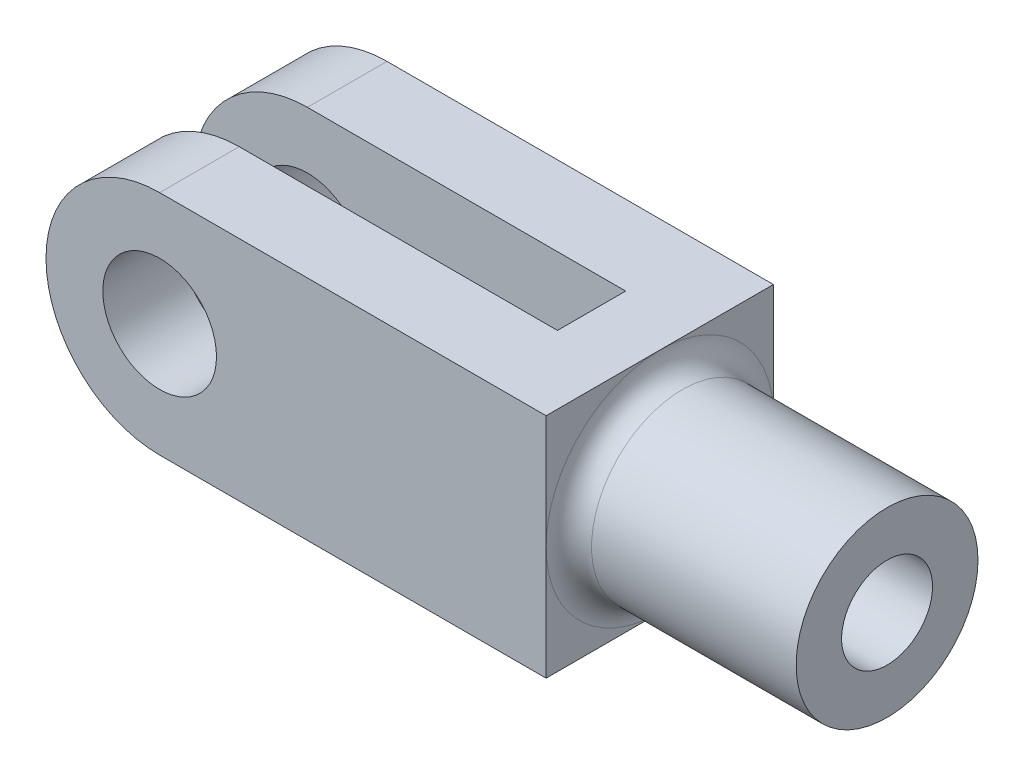
ISO-10303-21;
HEADER;
FILE_DESCRIPTION(('STEP AP214'),'2;1');
FILE_NAME('part.step','',(''),(''),'','','');
FILE_SCHEMA(('AUTOMOTIVE_DESIGN { 1 0 10303 214 1 1 1 1 }'));
ENDSEC;
DATA;
#1=APPLICATION_CONTEXT('core data for automotive mechanical design processes');
#2=APPLICATION_PROTOCOL_DEFINITION('international standard','automotive_design',2000,#1);
#3=PRODUCT_CONTEXT('',#1,'mechanical');
#4=PRODUCT('Part','Part','',(#3));
#5=PRODUCT_RELATED_PRODUCT_CATEGORY('part','',(#4));
#6=PRODUCT_DEFINITION_FORMATION('','',#4);
#7=PRODUCT_DEFINITION_CONTEXT('part definition',#1,'design');
#8=PRODUCT_DEFINITION('design','',#6,#7);
#9=PRODUCT_DEFINITION_SHAPE('','',#8);
#10=(LENGTH_UNIT() NAMED_UNIT(*) SI_UNIT(.MILLI.,.METRE.));
#11=(NAMED_UNIT(*) PLANE_ANGLE_UNIT() SI_UNIT($,.RADIAN.));
#12=(NAMED_UNIT(*) SI_UNIT($,.STERADIAN.) SOLID_ANGLE_UNIT());
#13=UNCERTAINTY_MEASURE_WITH_UNIT(LENGTH_MEASURE(1.E-05),#10,'distance_accuracy_value','');
#14=(GEOMETRIC_REPRESENTATION_CONTEXT(3) GLOBAL_UNCERTAINTY_ASSIGNED_CONTEXT((#13)) GLOBAL_UNIT_ASSIGNED_CONTEXT((#10,
#11,#12)) REPRESENTATION_CONTEXT('',''));
#15=CARTESIAN_POINT('',(0.,0.,0.));
#16=DIRECTION('',(0.,0.,1.));
#17=DIRECTION('',(1.,0.,0.));
#18=AXIS2_PLACEMENT_3D('',#15,#16,#17);
#19=CARTESIAN_POINT('',(17.,0.,5.));
#20=DIRECTION('',(1.,0.,0.));
#21=DIRECTION('',(0.,0.,-1.));
#22=AXIS2_PLACEMENT_3D('',#19,#20,#21);
#23=PLANE('',#22);
#24=DIRECTION('',(0.,-1.,0.));
#25=VECTOR('',#24,1.);
#26=CARTESIAN_POINT('',(17.,0.,-5.));
#27=LINE('',#26,#25);
#28=CARTESIAN_POINT('',(17.,0.,-5.));
#29=VERTEX_POINT('',#28);
#30=CARTESIAN_POINT('',(17.,-5.,-5.));
#31=VERTEX_POINT('',#30);
#32=EDGE_CURVE('E177',#29,#31,#27,.T.);
#33=ORIENTED_EDGE('',*,*,#32,.F.);
#34=CARTESIAN_POINT('',(17.,0.,0.));
#35=DIRECTION('',(1.,0.,0.));
#36=DIRECTION('',(0.,0.,-1.));
#37=AXIS2_PLACEMENT_3D('',#34,#35,#36);
#38=CIRCLE('',#37,5.);
#39=CARTESIAN_POINT('',(17.,-5.,0.));
#40=VERTEX_POINT('',#39);
#41=EDGE_CURVE('E11',#29,#40,#38,.F.);
#42=ORIENTED_EDGE('',*,*,#41,.T.);
#43=DIRECTION('',(0.,0.,-1.));
#44=VECTOR('',#43,1.);
#45=CARTESIAN_POINT('',(17.,-5.,5.));
#46=LINE('',#45,#44);
#47=EDGE_CURVE('E192',#40,#31,#46,.T.);
#48=ORIENTED_EDGE('',*,*,#47,.T.);
#49=EDGE_LOOP('',(#33,#42,#48));
#50=FACE_BOUND('',#49,.T.);
#51=ADVANCED_FACE('F36',(#50),#23,.T.);
#52=CARTESIAN_POINT('',(17.,-5.,5.));
#53=VERTEX_POINT('',#52);
#54=EDGE_CURVE('E193',#53,#40,#46,.T.);
#55=ORIENTED_EDGE('',*,*,#54,.T.);
#56=CARTESIAN_POINT('',(17.,0.,0.));
#57=DIRECTION('',(1.,0.,0.));
#58=DIRECTION('',(0.,0.,-1.));
#59=AXIS2_PLACEMENT_3D('',#56,#57,#58);
#60=CIRCLE('',#59,5.);
#61=CARTESIAN_POINT('',(17.,0.,5.));
#62=VERTEX_POINT('',#61);
#63=EDGE_CURVE('E44',#40,#62,#60,.F.);
#64=ORIENTED_EDGE('',*,*,#63,.T.);
#65=DIRECTION('',(0.,-1.,0.));
#66=VECTOR('',#65,1.);
#67=CARTESIAN_POINT('',(17.,0.,5.));
#68=LINE('',#67,#66);
#69=EDGE_CURVE('E162',#62,#53,#68,.T.);
#70=ORIENTED_EDGE('',*,*,#69,.T.);
#71=EDGE_LOOP('',(#55,#64,#70));
#72=FACE_BOUND('',#71,.T.);
#73=ADVANCED_FACE('F232',(#72),#23,.T.);
#74=CARTESIAN_POINT('',(17.,5.,5.));
#75=VERTEX_POINT('',#74);
#76=EDGE_CURVE('E163',#75,#62,#68,.T.);
#77=ORIENTED_EDGE('',*,*,#76,.T.);
#78=CARTESIAN_POINT('',(17.,0.,0.));
#79=DIRECTION('',(1.,0.,0.));
#80=DIRECTION('',(0.,0.,-1.));
#81=AXIS2_PLACEMENT_3D('',#78,#79,#80);
#82=CIRCLE('',#81,5.);
#83=CARTESIAN_POINT('',(17.,5.,0.));
#84=VERTEX_POINT('',#83);
#85=EDGE_CURVE('E211',#62,#84,#82,.F.);
#86=ORIENTED_EDGE('',*,*,#85,.T.);
#87=DIRECTION('',(0.,0.,-1.));
#88=VECTOR('',#87,1.);
#89=CARTESIAN_POINT('',(17.,5.,5.));
#90=LINE('',#89,#88);
#91=EDGE_CURVE('E189',#75,#84,#90,.T.);
#92=ORIENTED_EDGE('',*,*,#91,.F.);
#93=EDGE_LOOP('',(#77,#86,#92));
#94=FACE_BOUND('',#93,.T.);
#95=ADVANCED_FACE('F214',(#94),#23,.T.);
#96=CARTESIAN_POINT('',(0.,0.,5.));
#97=DIRECTION('',(0.,0.,-1.));
#98=DIRECTION('',(-1.,0.,0.));
#99=AXIS2_PLACEMENT_3D('',#96,#97,#98);
#100=CYLINDRICAL_SURFACE('',#99,5.);
#101=CARTESIAN_POINT('',(0.,0.,-1.5));
#102=DIRECTION('',(0.,0.,-1.));
#103=DIRECTION('',(-1.,0.,0.));
#104=AXIS2_PLACEMENT_3D('',#101,#102,#103);
#105=CIRCLE('',#104,5.);
#106=CARTESIAN_POINT('',(0.,5.,-1.5));
#107=VERTEX_POINT('',#106);
#108=CARTESIAN_POINT('',(0.,-5.,-1.5));
#109=VERTEX_POINT('',#108);
#110=EDGE_CURVE('E152',#107,#109,#105,.F.);
#111=ORIENTED_EDGE('',*,*,#110,.F.);
#112=DIRECTION('',(0.,0.,-1.));
#113=VECTOR('',#112,1.);
#114=CARTESIAN_POINT('',(0.,5.,5.));
#115=LINE('',#114,#113);
#116=CARTESIAN_POINT('',(0.,5.,-5.));
#117=VERTEX_POINT('',#116);
#118=EDGE_CURVE('E171',#107,#117,#115,.T.);
#119=ORIENTED_EDGE('',*,*,#118,.T.);
#120=CARTESIAN_POINT('',(0.,0.,-5.));
#121=DIRECTION('',(0.,0.,1.));
#122=DIRECTION('',(1.,0.,0.));
#123=AXIS2_PLACEMENT_3D('',#120,#121,#122);
#124=CIRCLE('',#123,5.);
#125=CARTESIAN_POINT('',(0.,-5.,-5.));
#126=VERTEX_POINT('',#125);
#127=EDGE_CURVE('E154',#126,#117,#124,.F.);
#128=ORIENTED_EDGE('',*,*,#127,.F.);
#129=DIRECTION('',(0.,0.,-1.));
#130=VECTOR('',#129,1.);
#131=CARTESIAN_POINT('',(0.,-5.,5.));
#132=LINE('',#131,#130);
#133=EDGE_CURVE('E195',#109,#126,#132,.T.);
#134=ORIENTED_EDGE('',*,*,#133,.F.);
#135=EDGE_LOOP('',(#111,#119,#128,#134));
#136=FACE_BOUND('',#135,.T.);
#137=ADVANCED_FACE('F241',(#136),#100,.T.);
#138=CARTESIAN_POINT('',(0.,0.,5.));
#139=DIRECTION('',(0.,0.,-1.));
#140=DIRECTION('',(-1.,0.,0.));
#141=AXIS2_PLACEMENT_3D('',#138,#139,#140);
#142=CYLINDRICAL_SURFACE('',#141,2.5);
#143=CARTESIAN_POINT('',(0.,0.,-1.5));
#144=DIRECTION('',(0.,0.,-1.));
#145=DIRECTION('',(-1.,0.,0.));
#146=AXIS2_PLACEMENT_3D('',#143,#144,#145);
#147=CIRCLE('',#146,2.5);
#148=CARTESIAN_POINT('',(-2.5,0.,-1.5));
#149=VERTEX_POINT('',#148);
#150=EDGE_CURVE('E151',#149,#149,#147,.T.);
#151=ORIENTED_EDGE('',*,*,#150,.F.);
#152=EDGE_LOOP('',(#151));
#153=FACE_BOUND('',#152,.T.);
#154=CARTESIAN_POINT('',(0.,0.,-5.));
#155=DIRECTION('',(0.,0.,1.));
#156=DIRECTION('',(1.,0.,0.));
#157=AXIS2_PLACEMENT_3D('',#154,#155,#156);
#158=CIRCLE('',#157,2.5);
#159=CARTESIAN_POINT('',(2.5,0.,-5.));
#160=VERTEX_POINT('',#159);
#161=EDGE_CURVE('E159',#160,#160,#158,.T.);
#162=ORIENTED_EDGE('',*,*,#161,.F.);
#163=EDGE_LOOP('',(#162));
#164=FACE_BOUND('',#163,.T.);
#165=ADVANCED_FACE('F240',(#153,#164),#142,.F.);
#166=CARTESIAN_POINT('',(0.,0.,1.5));
#167=DIRECTION('',(0.,0.,1.));
#168=DIRECTION('',(1.,0.,0.));
#169=AXIS2_PLACEMENT_3D('',#166,#167,#168);
#170=CIRCLE('',#169,5.);
#171=CARTESIAN_POINT('',(0.,-5.,1.5));
#172=VERTEX_POINT('',#171);
#173=CARTESIAN_POINT('',(0.,5.,1.5));
#174=VERTEX_POINT('',#173);
#175=EDGE_CURVE('E117',#172,#174,#170,.F.);
#176=ORIENTED_EDGE('',*,*,#175,.F.);
#177=CARTESIAN_POINT('',(0.,-5.,5.));
#178=VERTEX_POINT('',#177);
#179=EDGE_CURVE('E196',#178,#172,#132,.T.);
#180=ORIENTED_EDGE('',*,*,#179,.F.);
#181=CARTESIAN_POINT('',(0.,0.,5.));
#182=DIRECTION('',(0.,0.,1.));
#183=DIRECTION('',(1.,0.,0.));
#184=AXIS2_PLACEMENT_3D('',#181,#182,#183);
#185=CIRCLE('',#184,5.);
#186=CARTESIAN_POINT('',(0.,5.,5.));
#187=VERTEX_POINT('',#186);
#188=EDGE_CURVE('E155',#178,#187,#185,.F.);
#189=ORIENTED_EDGE('',*,*,#188,.T.);
#190=EDGE_CURVE('E186',#187,#174,#115,.T.);
#191=ORIENTED_EDGE('',*,*,#190,.T.);
#192=EDGE_LOOP('',(#176,#180,#189,#191));
#193=FACE_BOUND('',#192,.T.);
#194=ADVANCED_FACE('F238',(#193),#100,.T.);
#195=CARTESIAN_POINT('',(0.,-5.,5.));
#196=DIRECTION('',(0.,-1.,0.));
#197=DIRECTION('',(1.,0.,0.));
#198=AXIS2_PLACEMENT_3D('',#195,#196,#197);
#199=PLANE('',#198);
#200=DIRECTION('',(-1.,0.,0.));
#201=VECTOR('',#200,1.);
#202=CARTESIAN_POINT('',(14.,-5.,-1.5));
#203=LINE('',#202,#201);
#204=CARTESIAN_POINT('',(14.,-5.,-1.5));
#205=VERTEX_POINT('',#204);
#206=EDGE_CURVE('E133',#205,#109,#203,.T.);
#207=ORIENTED_EDGE('',*,*,#206,.T.);
#208=ORIENTED_EDGE('',*,*,#133,.T.);
#209=DIRECTION('',(-1.,0.,0.));
#210=VECTOR('',#209,1.);
#211=CARTESIAN_POINT('',(0.,-5.,-5.));
#212=LINE('',#211,#210);
#213=EDGE_CURVE('E174',#31,#126,#212,.T.);
#214=ORIENTED_EDGE('',*,*,#213,.F.);
#215=ORIENTED_EDGE('',*,*,#47,.F.);
#216=ORIENTED_EDGE('',*,*,#54,.F.);
#217=DIRECTION('',(-1.,0.,0.));
#218=VECTOR('',#217,1.);
#219=CARTESIAN_POINT('',(0.,-5.,5.));
#220=LINE('',#219,#218);
#221=EDGE_CURVE('E158',#53,#178,#220,.T.);
#222=ORIENTED_EDGE('',*,*,#221,.T.);
#223=ORIENTED_EDGE('',*,*,#179,.T.);
#224=DIRECTION('',(1.,0.,0.));
#225=VECTOR('',#224,1.);
#226=CARTESIAN_POINT('',(14.,-5.,1.5));
#227=LINE('',#226,#225);
#228=CARTESIAN_POINT('',(14.,-5.,1.5));
#229=VERTEX_POINT('',#228);
#230=EDGE_CURVE('E140',#172,#229,#227,.T.);
#231=ORIENTED_EDGE('',*,*,#230,.T.);
#232=DIRECTION('',(0.,0.,-1.));
#233=VECTOR('',#232,1.);
#234=CARTESIAN_POINT('',(14.,-5.,-1.5));
#235=LINE('',#234,#233);
#236=EDGE_CURVE('E130',#229,#205,#235,.T.);
#237=ORIENTED_EDGE('',*,*,#236,.T.);
#238=EDGE_LOOP('',(#207,#208,#214,#215,#216,#222,#223,#231,#237));
#239=FACE_BOUND('',#238,.T.);
#240=ADVANCED_FACE('F230',(#239),#199,.T.);
#241=CARTESIAN_POINT('',(17.,5.,-5.));
#242=VERTEX_POINT('',#241);
#243=EDGE_CURVE('E188',#84,#242,#90,.T.);
#244=ORIENTED_EDGE('',*,*,#243,.F.);
#245=CARTESIAN_POINT('',(17.,0.,0.));
#246=DIRECTION('',(1.,0.,0.));
#247=DIRECTION('',(0.,0.,-1.));
#248=AXIS2_PLACEMENT_3D('',#245,#246,#247);
#249=CIRCLE('',#248,5.);
#250=EDGE_CURVE('E209',#84,#29,#249,.F.);
#251=ORIENTED_EDGE('',*,*,#250,.T.);
#252=EDGE_CURVE('E178',#242,#29,#27,.T.);
#253=ORIENTED_EDGE('',*,*,#252,.F.);
#254=EDGE_LOOP('',(#244,#251,#253));
#255=FACE_BOUND('',#254,.T.);
#256=ADVANCED_FACE('F220',(#255),#23,.T.);
#257=CARTESIAN_POINT('',(0.,5.,5.));
#258=DIRECTION('',(0.,-1.,0.));
#259=DIRECTION('',(1.,0.,0.));
#260=AXIS2_PLACEMENT_3D('',#257,#258,#259);
#261=PLANE('',#260);
#262=ORIENTED_EDGE('',*,*,#118,.F.);
#263=DIRECTION('',(-1.,0.,0.));
#264=VECTOR('',#263,1.);
#265=CARTESIAN_POINT('',(14.,5.,-1.5));
#266=LINE('',#265,#264);
#267=CARTESIAN_POINT('',(14.,5.,-1.5));
#268=VERTEX_POINT('',#267);
#269=EDGE_CURVE('E138',#268,#107,#266,.T.);
#270=ORIENTED_EDGE('',*,*,#269,.F.);
#271=DIRECTION('',(0.,0.,-1.));
#272=VECTOR('',#271,1.);
#273=CARTESIAN_POINT('',(14.,5.,-1.5));
#274=LINE('',#273,#272);
#275=CARTESIAN_POINT('',(14.,5.,1.5));
#276=VERTEX_POINT('',#275);
#277=EDGE_CURVE('E122',#276,#268,#274,.T.);
#278=ORIENTED_EDGE('',*,*,#277,.F.);
#279=DIRECTION('',(1.,0.,0.));
#280=VECTOR('',#279,1.);
#281=CARTESIAN_POINT('',(14.,5.,1.5));
#282=LINE('',#281,#280);
#283=EDGE_CURVE('E110',#174,#276,#282,.T.);
#284=ORIENTED_EDGE('',*,*,#283,.F.);
#285=ORIENTED_EDGE('',*,*,#190,.F.);
#286=DIRECTION('',(-1.,0.,0.));
#287=VECTOR('',#286,1.);
#288=CARTESIAN_POINT('',(0.,5.,5.));
#289=LINE('',#288,#287);
#290=EDGE_CURVE('E166',#75,#187,#289,.T.);
#291=ORIENTED_EDGE('',*,*,#290,.F.);
#292=ORIENTED_EDGE('',*,*,#91,.T.);
#293=ORIENTED_EDGE('',*,*,#243,.T.);
#294=DIRECTION('',(-1.,0.,0.));
#295=VECTOR('',#294,1.);
#296=CARTESIAN_POINT('',(0.,5.,-5.));
#297=LINE('',#296,#295);
#298=EDGE_CURVE('E181',#242,#117,#297,.T.);
#299=ORIENTED_EDGE('',*,*,#298,.T.);
#300=EDGE_LOOP('',(#262,#270,#278,#284,#285,#291,#292,#293,#299));
#301=FACE_BOUND('',#300,.T.);
#302=ADVANCED_FACE('F136',(#301),#261,.F.);
#303=CARTESIAN_POINT('',(0.,0.,1.5));
#304=DIRECTION('',(0.,0.,1.));
#305=DIRECTION('',(1.,0.,0.));
#306=AXIS2_PLACEMENT_3D('',#303,#304,#305);
#307=CIRCLE('',#306,2.5);
#308=CARTESIAN_POINT('',(2.5,0.,1.5));
#309=VERTEX_POINT('',#308);
#310=EDGE_CURVE('E148',#309,#309,#307,.T.);
#311=ORIENTED_EDGE('',*,*,#310,.F.);
#312=EDGE_LOOP('',(#311));
#313=FACE_BOUND('',#312,.T.);
#314=CARTESIAN_POINT('',(0.,0.,5.));
#315=DIRECTION('',(0.,0.,1.));
#316=DIRECTION('',(1.,0.,0.));
#317=AXIS2_PLACEMENT_3D('',#314,#315,#316);
#318=CIRCLE('',#317,2.5);
#319=CARTESIAN_POINT('',(2.5,0.,5.));
#320=VERTEX_POINT('',#319);
#321=EDGE_CURVE('E168',#320,#320,#318,.T.);
#322=ORIENTED_EDGE('',*,*,#321,.T.);
#323=EDGE_LOOP('',(#322));
#324=FACE_BOUND('',#323,.T.);
#325=ADVANCED_FACE('F249',(#313,#324),#142,.F.);
#326=CARTESIAN_POINT('',(0.,0.,5.));
#327=DIRECTION('',(0.,0.,1.));
#328=DIRECTION('',(1.,0.,0.));
#329=AXIS2_PLACEMENT_3D('',#326,#327,#328);
#330=PLANE('',#329);
#331=ORIENTED_EDGE('',*,*,#188,.F.);
#332=ORIENTED_EDGE('',*,*,#221,.F.);
#333=ORIENTED_EDGE('',*,*,#69,.F.);
#334=ORIENTED_EDGE('',*,*,#76,.F.);
#335=ORIENTED_EDGE('',*,*,#290,.T.);
#336=EDGE_LOOP('',(#331,#332,#333,#334,#335));
#337=FACE_BOUND('',#336,.T.);
#338=ORIENTED_EDGE('',*,*,#321,.F.);
#339=EDGE_LOOP('',(#338));
#340=FACE_BOUND('',#339,.T.);
#341=ADVANCED_FACE('F235',(#337,#340),#330,.T.);
#342=CARTESIAN_POINT('',(0.,0.,-5.));
#343=DIRECTION('',(0.,0.,1.));
#344=DIRECTION('',(1.,0.,0.));
#345=AXIS2_PLACEMENT_3D('',#342,#343,#344);
#346=PLANE('',#345);
#347=ORIENTED_EDGE('',*,*,#127,.T.);
#348=ORIENTED_EDGE('',*,*,#298,.F.);
#349=ORIENTED_EDGE('',*,*,#252,.T.);
#350=ORIENTED_EDGE('',*,*,#32,.T.);
#351=ORIENTED_EDGE('',*,*,#213,.T.);
#352=EDGE_LOOP('',(#347,#348,#349,#350,#351));
#353=FACE_BOUND('',#352,.T.);
#354=ORIENTED_EDGE('',*,*,#161,.T.);
#355=EDGE_LOOP('',(#354));
#356=FACE_BOUND('',#355,.T.);
#357=ADVANCED_FACE('F315',(#353,#356),#346,.F.);
#358=CARTESIAN_POINT('',(14.,-5.,-1.5));
#359=DIRECTION('',(0.,0.,-1.));
#360=DIRECTION('',(-1.,0.,0.));
#361=AXIS2_PLACEMENT_3D('',#358,#359,#360);
#362=PLANE('',#361);
#363=ORIENTED_EDGE('',*,*,#110,.T.);
#364=ORIENTED_EDGE('',*,*,#206,.F.);
#365=DIRECTION('',(0.,1.,0.));
#366=VECTOR('',#365,1.);
#367=CARTESIAN_POINT('',(14.,-5.,-1.5));
#368=LINE('',#367,#366);
#369=EDGE_CURVE('E132',#205,#268,#368,.T.);
#370=ORIENTED_EDGE('',*,*,#369,.T.);
#371=ORIENTED_EDGE('',*,*,#269,.T.);
#372=EDGE_LOOP('',(#363,#364,#370,#371));
#373=FACE_BOUND('',#372,.T.);
#374=ORIENTED_EDGE('',*,*,#150,.T.);
#375=EDGE_LOOP('',(#374));
#376=FACE_BOUND('',#375,.T.);
#377=ADVANCED_FACE('F310',(#373,#376),#362,.F.);
#378=CARTESIAN_POINT('',(14.,-5.,-1.5));
#379=DIRECTION('',(1.,0.,0.));
#380=DIRECTION('',(0.,0.,-1.));
#381=AXIS2_PLACEMENT_3D('',#378,#379,#380);
#382=PLANE('',#381);
#383=ORIENTED_EDGE('',*,*,#369,.F.);
#384=ORIENTED_EDGE('',*,*,#236,.F.);
#385=DIRECTION('',(0.,1.,0.));
#386=VECTOR('',#385,1.);
#387=CARTESIAN_POINT('',(14.,-5.,1.5));
#388=LINE('',#387,#386);
#389=EDGE_CURVE('E114',#229,#276,#388,.T.);
#390=ORIENTED_EDGE('',*,*,#389,.T.);
#391=ORIENTED_EDGE('',*,*,#277,.T.);
#392=EDGE_LOOP('',(#383,#384,#390,#391));
#393=FACE_BOUND('',#392,.T.);
#394=ADVANCED_FACE('F127',(#393),#382,.F.);
#395=CARTESIAN_POINT('',(14.,-5.,1.5));
#396=DIRECTION('',(0.,0.,1.));
#397=DIRECTION('',(1.,0.,0.));
#398=AXIS2_PLACEMENT_3D('',#395,#396,#397);
#399=PLANE('',#398);
#400=ORIENTED_EDGE('',*,*,#175,.T.);
#401=ORIENTED_EDGE('',*,*,#283,.T.);
#402=ORIENTED_EDGE('',*,*,#389,.F.);
#403=ORIENTED_EDGE('',*,*,#230,.F.);
#404=EDGE_LOOP('',(#400,#401,#402,#403));
#405=FACE_BOUND('',#404,.T.);
#406=ORIENTED_EDGE('',*,*,#310,.T.);
#407=EDGE_LOOP('',(#406));
#408=FACE_BOUND('',#407,.T.);
#409=ADVANCED_FACE('F112',(#405,#408),#399,.F.);
#410=CARTESIAN_POINT('',(27.,0.,0.));
#411=DIRECTION('',(-1.,0.,0.));
#412=DIRECTION('',(0.,0.,1.));
#413=AXIS2_PLACEMENT_3D('',#410,#411,#412);
#414=CYLINDRICAL_SURFACE('',#413,2.);
#415=CARTESIAN_POINT('',(27.,0.,0.));
#416=DIRECTION('',(1.,0.,0.));
#417=DIRECTION('',(0.,0.,-1.));
#418=AXIS2_PLACEMENT_3D('',#415,#416,#417);
#419=CIRCLE('',#418,2.);
#420=CARTESIAN_POINT('',(27.,0.,-2.));
#421=VERTEX_POINT('',#420);
#422=EDGE_CURVE('E429',#421,#421,#419,.T.);
#423=ORIENTED_EDGE('',*,*,#422,.T.);
#424=EDGE_LOOP('',(#423));
#425=FACE_BOUND('',#424,.T.);
#426=CARTESIAN_POINT('',(17.,0.,0.));
#427=DIRECTION('',(1.,0.,0.));
#428=DIRECTION('',(0.,0.,-1.));
#429=AXIS2_PLACEMENT_3D('',#426,#427,#428);
#430=CIRCLE('',#429,2.);
#431=CARTESIAN_POINT('',(17.,0.,-2.));
#432=VERTEX_POINT('',#431);
#433=EDGE_CURVE('E199',#432,#432,#430,.F.);
#434=ORIENTED_EDGE('',*,*,#433,.T.);
#435=EDGE_LOOP('',(#434));
#436=FACE_BOUND('',#435,.T.);
#437=ADVANCED_FACE('F334',(#425,#436),#414,.F.);
#438=CARTESIAN_POINT('',(27.,0.,0.));
#439=DIRECTION('',(-1.,0.,0.));
#440=DIRECTION('',(0.,0.,1.));
#441=AXIS2_PLACEMENT_3D('',#438,#439,#440);
#442=CYLINDRICAL_SURFACE('',#441,4.);
#443=CARTESIAN_POINT('',(18.,0.,0.));
#444=DIRECTION('',(1.,0.,0.));
#445=DIRECTION('',(0.,0.,-1.));
#446=AXIS2_PLACEMENT_3D('',#443,#444,#445);
#447=CIRCLE('',#446,4.);
#448=CARTESIAN_POINT('',(18.,0.,-4.));
#449=VERTEX_POINT('',#448);
#450=EDGE_CURVE('E206',#449,#449,#447,.T.);
#451=ORIENTED_EDGE('',*,*,#450,.T.);
#452=EDGE_LOOP('',(#451));
#453=FACE_BOUND('',#452,.T.);
#454=CARTESIAN_POINT('',(27.,0.,0.));
#455=DIRECTION('',(1.,0.,0.));
#456=DIRECTION('',(0.,0.,-1.));
#457=AXIS2_PLACEMENT_3D('',#454,#455,#456);
#458=CIRCLE('',#457,4.);
#459=CARTESIAN_POINT('',(27.,0.,-4.));
#460=VERTEX_POINT('',#459);
#461=EDGE_CURVE('E123',#460,#460,#458,.T.);
#462=ORIENTED_EDGE('',*,*,#461,.F.);
#463=EDGE_LOOP('',(#462));
#464=FACE_BOUND('',#463,.T.);
#465=ADVANCED_FACE('F270',(#453,#464),#442,.T.);
#466=CARTESIAN_POINT('',(27.,0.,0.));
#467=DIRECTION('',(1.,0.,0.));
#468=DIRECTION('',(0.,0.,-1.));
#469=AXIS2_PLACEMENT_3D('',#466,#467,#468);
#470=PLANE('',#469);
#471=ORIENTED_EDGE('',*,*,#422,.F.);
#472=EDGE_LOOP('',(#471));
#473=FACE_BOUND('',#472,.T.);
#474=ORIENTED_EDGE('',*,*,#461,.T.);
#475=EDGE_LOOP('',(#474));
#476=FACE_BOUND('',#475,.T.);
#477=ADVANCED_FACE('F264',(#473,#476),#470,.T.);
#478=ORIENTED_EDGE('',*,*,#433,.F.);
#479=EDGE_LOOP('',(#478));
#480=FACE_BOUND('',#479,.T.);
#481=ADVANCED_FACE('F259',(#480),#23,.T.);
#482=CARTESIAN_POINT('',(18.,0.,0.));
#483=DIRECTION('',(1.,0.,0.));
#484=DIRECTION('',(0.,0.,-1.));
#485=AXIS2_PLACEMENT_3D('',#482,#483,#484);
#486=TOROIDAL_SURFACE('',#485,5.,1.);
#487=ORIENTED_EDGE('',*,*,#63,.F.);
#488=ORIENTED_EDGE('',*,*,#41,.F.);
#489=ORIENTED_EDGE('',*,*,#250,.F.);
#490=ORIENTED_EDGE('',*,*,#85,.F.);
#491=EDGE_LOOP('',(#487,#488,#489,#490));
#492=FACE_BOUND('',#491,.T.);
#493=ORIENTED_EDGE('',*,*,#450,.F.);
#494=EDGE_LOOP('',(#493));
#495=FACE_BOUND('',#494,.T.);
#496=ADVANCED_FACE('F38',(#492,#495),#486,.F.);
#497=CLOSED_SHELL('',(#51,#73,#95,#137,#165,#194,#240,#256,#302,#325,#341,#357,#377,#394,#409,
#437,#465,#477,#481,#496));
#498=MANIFOLD_SOLID_BREP('B2',#497);
#499=ADVANCED_BREP_SHAPE_REPRESENTATION('',(#18,#498),#14);
#500=SHAPE_DEFINITION_REPRESENTATION(#9,#499);
ENDSEC;
END-ISO-10303-21;
